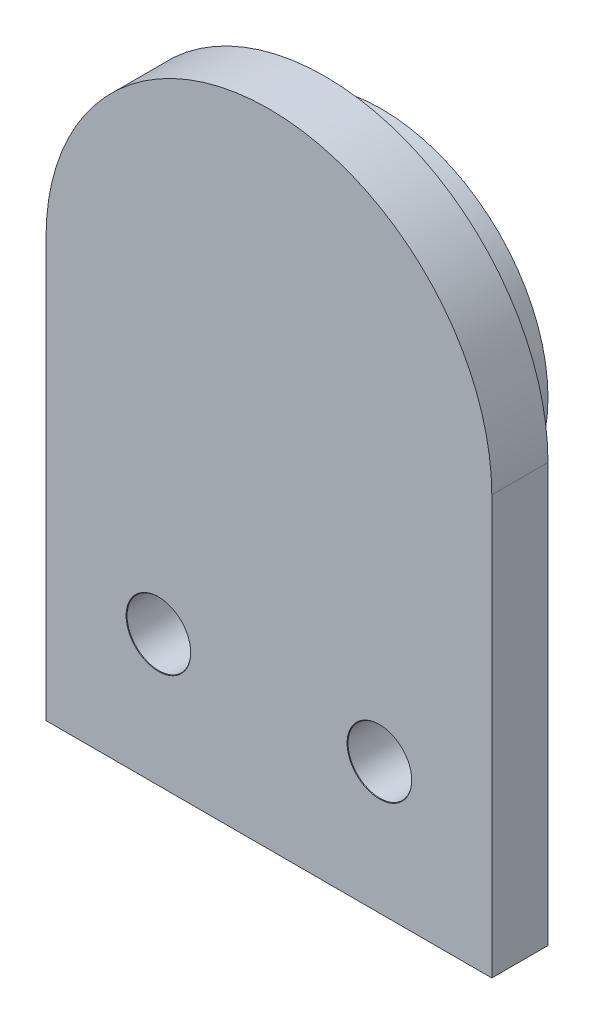
ISO-10303-21;
HEADER;
FILE_DESCRIPTION(('STEP AP214'),'2;1');
FILE_NAME('part.step','',(''),(''),'','','');
FILE_SCHEMA(('AUTOMOTIVE_DESIGN { 1 0 10303 214 1 1 1 1 }'));
ENDSEC;
DATA;
#1=APPLICATION_CONTEXT('core data for automotive mechanical design processes');
#2=APPLICATION_PROTOCOL_DEFINITION('international standard','automotive_design',2000,#1);
#3=PRODUCT_CONTEXT('',#1,'mechanical');
#4=PRODUCT('Part','Part','',(#3));
#5=PRODUCT_RELATED_PRODUCT_CATEGORY('part','',(#4));
#6=PRODUCT_DEFINITION_FORMATION('','',#4);
#7=PRODUCT_DEFINITION_CONTEXT('part definition',#1,'design');
#8=PRODUCT_DEFINITION('design','',#6,#7);
#9=PRODUCT_DEFINITION_SHAPE('','',#8);
#10=(LENGTH_UNIT() NAMED_UNIT(*) SI_UNIT(.MILLI.,.METRE.));
#11=(NAMED_UNIT(*) PLANE_ANGLE_UNIT() SI_UNIT($,.RADIAN.));
#12=(NAMED_UNIT(*) SI_UNIT($,.STERADIAN.) SOLID_ANGLE_UNIT());
#13=UNCERTAINTY_MEASURE_WITH_UNIT(LENGTH_MEASURE(1.E-05),#10,'distance_accuracy_value','');
#14=(GEOMETRIC_REPRESENTATION_CONTEXT(3) GLOBAL_UNCERTAINTY_ASSIGNED_CONTEXT((#13)) GLOBAL_UNIT_ASSIGNED_CONTEXT((#10,
#11,#12)) REPRESENTATION_CONTEXT('',''));
#15=CARTESIAN_POINT('',(0.,0.,0.));
#16=DIRECTION('',(0.,0.,1.));
#17=DIRECTION('',(1.,0.,0.));
#18=AXIS2_PLACEMENT_3D('',#15,#16,#17);
#19=CARTESIAN_POINT('',(0.,0.,3.));
#20=DIRECTION('',(0.,0.,-1.));
#21=DIRECTION('',(-1.,0.,0.));
#22=AXIS2_PLACEMENT_3D('',#19,#20,#21);
#23=CYLINDRICAL_SURFACE('',#22,11.9);
#24=CARTESIAN_POINT('',(0.,0.,0.));
#25=DIRECTION('',(0.,0.,1.));
#26=DIRECTION('',(1.,0.,0.));
#27=AXIS2_PLACEMENT_3D('',#24,#25,#26);
#28=CIRCLE('',#27,11.9);
#29=CARTESIAN_POINT('',(11.9,0.,0.));
#30=VERTEX_POINT('',#29);
#31=CARTESIAN_POINT('',(-11.9,0.,0.));
#32=VERTEX_POINT('',#31);
#33=EDGE_CURVE('E106',#30,#32,#28,.T.);
#34=ORIENTED_EDGE('',*,*,#33,.T.);
#35=DIRECTION('',(0.,0.,-1.));
#36=VECTOR('',#35,1.);
#37=CARTESIAN_POINT('',(-11.9,0.,3.));
#38=LINE('',#37,#36);
#39=CARTESIAN_POINT('',(-11.9,0.,3.));
#40=VERTEX_POINT('',#39);
#41=EDGE_CURVE('E97',#40,#32,#38,.T.);
#42=ORIENTED_EDGE('',*,*,#41,.F.);
#43=CARTESIAN_POINT('',(0.,0.,3.));
#44=DIRECTION('',(0.,0.,1.));
#45=DIRECTION('',(1.,0.,0.));
#46=AXIS2_PLACEMENT_3D('',#43,#44,#45);
#47=CIRCLE('',#46,11.9);
#48=CARTESIAN_POINT('',(11.9,0.,3.));
#49=VERTEX_POINT('',#48);
#50=EDGE_CURVE('E91',#49,#40,#47,.T.);
#51=ORIENTED_EDGE('',*,*,#50,.F.);
#52=DIRECTION('',(0.,0.,-1.));
#53=VECTOR('',#52,1.);
#54=CARTESIAN_POINT('',(11.9,0.,3.));
#55=LINE('',#54,#53);
#56=EDGE_CURVE('E102',#49,#30,#55,.T.);
#57=ORIENTED_EDGE('',*,*,#56,.T.);
#58=EDGE_LOOP('',(#34,#42,#51,#57));
#59=FACE_BOUND('',#58,.T.);
#60=ADVANCED_FACE('F37',(#59),#23,.T.);
#61=CARTESIAN_POINT('',(-11.9,0.,3.));
#62=DIRECTION('',(1.,0.,0.));
#63=DIRECTION('',(0.,0.,-1.));
#64=AXIS2_PLACEMENT_3D('',#61,#62,#63);
#65=PLANE('',#64);
#66=DIRECTION('',(0.,-1.,0.));
#67=VECTOR('',#66,1.);
#68=CARTESIAN_POINT('',(-11.9,0.,0.));
#69=LINE('',#68,#67);
#70=CARTESIAN_POINT('',(-11.9,-22.34,0.));
#71=VERTEX_POINT('',#70);
#72=EDGE_CURVE('E96',#32,#71,#69,.T.);
#73=ORIENTED_EDGE('',*,*,#72,.T.);
#74=DIRECTION('',(0.,0.,-1.));
#75=VECTOR('',#74,1.);
#76=CARTESIAN_POINT('',(-11.9,-22.34,3.));
#77=LINE('',#76,#75);
#78=CARTESIAN_POINT('',(-11.9,-22.34,3.));
#79=VERTEX_POINT('',#78);
#80=EDGE_CURVE('E94',#79,#71,#77,.T.);
#81=ORIENTED_EDGE('',*,*,#80,.F.);
#82=DIRECTION('',(0.,-1.,0.));
#83=VECTOR('',#82,1.);
#84=CARTESIAN_POINT('',(-11.9,0.,3.));
#85=LINE('',#84,#83);
#86=EDGE_CURVE('E86',#40,#79,#85,.T.);
#87=ORIENTED_EDGE('',*,*,#86,.F.);
#88=ORIENTED_EDGE('',*,*,#41,.T.);
#89=EDGE_LOOP('',(#73,#81,#87,#88));
#90=FACE_BOUND('',#89,.T.);
#91=ADVANCED_FACE('F95',(#90),#65,.F.);
#92=CARTESIAN_POINT('',(-11.9,-22.34,3.));
#93=DIRECTION('',(0.,1.,0.));
#94=DIRECTION('',(0.,0.,1.));
#95=AXIS2_PLACEMENT_3D('',#92,#93,#94);
#96=PLANE('',#95);
#97=DIRECTION('',(1.,0.,0.));
#98=VECTOR('',#97,1.);
#99=CARTESIAN_POINT('',(-11.9,-22.34,0.));
#100=LINE('',#99,#98);
#101=CARTESIAN_POINT('',(11.9,-22.34,0.));
#102=VERTEX_POINT('',#101);
#103=EDGE_CURVE('E72',#71,#102,#100,.T.);
#104=ORIENTED_EDGE('',*,*,#103,.T.);
#105=DIRECTION('',(0.,0.,-1.));
#106=VECTOR('',#105,1.);
#107=CARTESIAN_POINT('',(11.9,-22.34,3.));
#108=LINE('',#107,#106);
#109=CARTESIAN_POINT('',(11.9,-22.34,3.));
#110=VERTEX_POINT('',#109);
#111=EDGE_CURVE('E98',#110,#102,#108,.T.);
#112=ORIENTED_EDGE('',*,*,#111,.F.);
#113=DIRECTION('',(1.,0.,0.));
#114=VECTOR('',#113,1.);
#115=CARTESIAN_POINT('',(-11.9,-22.34,3.));
#116=LINE('',#115,#114);
#117=EDGE_CURVE('E89',#79,#110,#116,.T.);
#118=ORIENTED_EDGE('',*,*,#117,.F.);
#119=ORIENTED_EDGE('',*,*,#80,.T.);
#120=EDGE_LOOP('',(#104,#112,#118,#119));
#121=FACE_BOUND('',#120,.T.);
#122=ADVANCED_FACE('F100',(#121),#96,.F.);
#123=CARTESIAN_POINT('',(11.9,-22.34,3.));
#124=DIRECTION('',(-1.,0.,0.));
#125=DIRECTION('',(0.,0.,1.));
#126=AXIS2_PLACEMENT_3D('',#123,#124,#125);
#127=PLANE('',#126);
#128=DIRECTION('',(0.,1.,0.));
#129=VECTOR('',#128,1.);
#130=CARTESIAN_POINT('',(11.9,-22.34,0.));
#131=LINE('',#130,#129);
#132=EDGE_CURVE('E78',#102,#30,#131,.T.);
#133=ORIENTED_EDGE('',*,*,#132,.T.);
#134=ORIENTED_EDGE('',*,*,#56,.F.);
#135=DIRECTION('',(0.,1.,0.));
#136=VECTOR('',#135,1.);
#137=CARTESIAN_POINT('',(11.9,-22.34,3.));
#138=LINE('',#137,#136);
#139=EDGE_CURVE('E55',#110,#49,#138,.T.);
#140=ORIENTED_EDGE('',*,*,#139,.F.);
#141=ORIENTED_EDGE('',*,*,#111,.T.);
#142=EDGE_LOOP('',(#133,#134,#140,#141));
#143=FACE_BOUND('',#142,.T.);
#144=ADVANCED_FACE('F146',(#143),#127,.F.);
#145=CARTESIAN_POINT('',(0.,0.,3.));
#146=DIRECTION('',(0.,0.,1.));
#147=DIRECTION('',(1.,0.,0.));
#148=AXIS2_PLACEMENT_3D('',#145,#146,#147);
#149=PLANE('',#148);
#150=CARTESIAN_POINT('',(-5.9,-15.34,3.));
#151=DIRECTION('',(0.,0.,1.));
#152=DIRECTION('',(1.,0.,0.));
#153=AXIS2_PLACEMENT_3D('',#150,#151,#152);
#154=CIRCLE('',#153,1.725);
#155=CARTESIAN_POINT('',(-4.175,-15.34,3.));
#156=VERTEX_POINT('',#155);
#157=EDGE_CURVE('E304',#156,#156,#154,.T.);
#158=ORIENTED_EDGE('',*,*,#157,.F.);
#159=EDGE_LOOP('',(#158));
#160=FACE_BOUND('',#159,.T.);
#161=CARTESIAN_POINT('',(5.9,-15.34,3.));
#162=DIRECTION('',(0.,0.,1.));
#163=DIRECTION('',(1.,0.,0.));
#164=AXIS2_PLACEMENT_3D('',#161,#162,#163);
#165=CIRCLE('',#164,1.725);
#166=CARTESIAN_POINT('',(7.625,-15.34,3.));
#167=VERTEX_POINT('',#166);
#168=EDGE_CURVE('E124',#167,#167,#165,.T.);
#169=ORIENTED_EDGE('',*,*,#168,.F.);
#170=EDGE_LOOP('',(#169));
#171=FACE_BOUND('',#170,.T.);
#172=ORIENTED_EDGE('',*,*,#50,.T.);
#173=ORIENTED_EDGE('',*,*,#86,.T.);
#174=ORIENTED_EDGE('',*,*,#117,.T.);
#175=ORIENTED_EDGE('',*,*,#139,.T.);
#176=EDGE_LOOP('',(#172,#173,#174,#175));
#177=FACE_BOUND('',#176,.T.);
#178=ADVANCED_FACE('F87',(#160,#171,#177),#149,.T.);
#179=CARTESIAN_POINT('',(0.,0.,0.));
#180=DIRECTION('',(0.,0.,1.));
#181=DIRECTION('',(1.,0.,0.));
#182=AXIS2_PLACEMENT_3D('',#179,#180,#181);
#183=PLANE('',#182);
#184=CARTESIAN_POINT('',(-5.9,-15.34,0.));
#185=DIRECTION('',(0.,0.,1.));
#186=DIRECTION('',(1.,0.,0.));
#187=AXIS2_PLACEMENT_3D('',#184,#185,#186);
#188=CIRCLE('',#187,1.7);
#189=CARTESIAN_POINT('',(-4.2,-15.34,0.));
#190=VERTEX_POINT('',#189);
#191=EDGE_CURVE('E40',#190,#190,#188,.T.);
#192=ORIENTED_EDGE('',*,*,#191,.T.);
#193=EDGE_LOOP('',(#192));
#194=FACE_BOUND('',#193,.T.);
#195=CARTESIAN_POINT('',(5.9,-15.34,0.));
#196=DIRECTION('',(0.,0.,1.));
#197=DIRECTION('',(1.,0.,0.));
#198=AXIS2_PLACEMENT_3D('',#195,#196,#197);
#199=CIRCLE('',#198,1.7);
#200=CARTESIAN_POINT('',(7.6,-15.34,0.));
#201=VERTEX_POINT('',#200);
#202=EDGE_CURVE('E115',#201,#201,#199,.T.);
#203=ORIENTED_EDGE('',*,*,#202,.T.);
#204=EDGE_LOOP('',(#203));
#205=FACE_BOUND('',#204,.T.);
#206=CARTESIAN_POINT('',(0.,0.,0.));
#207=DIRECTION('',(0.,0.,-1.));
#208=DIRECTION('',(-1.,0.,0.));
#209=AXIS2_PLACEMENT_3D('',#206,#207,#208);
#210=CIRCLE('',#209,8.9);
#211=CARTESIAN_POINT('',(-8.9,0.,0.));
#212=VERTEX_POINT('',#211);
#213=EDGE_CURVE('E46',#212,#212,#210,.T.);
#214=ORIENTED_EDGE('',*,*,#213,.F.);
#215=EDGE_LOOP('',(#214));
#216=FACE_BOUND('',#215,.T.);
#217=ORIENTED_EDGE('',*,*,#33,.F.);
#218=ORIENTED_EDGE('',*,*,#132,.F.);
#219=ORIENTED_EDGE('',*,*,#103,.F.);
#220=ORIENTED_EDGE('',*,*,#72,.F.);
#221=EDGE_LOOP('',(#217,#218,#219,#220));
#222=FACE_BOUND('',#221,.T.);
#223=ADVANCED_FACE('F139',(#194,#205,#216,#222),#183,.F.);
#224=CARTESIAN_POINT('',(0.,0.,-3.));
#225=DIRECTION('',(0.,0.,1.));
#226=DIRECTION('',(1.,0.,0.));
#227=AXIS2_PLACEMENT_3D('',#224,#225,#226);
#228=CYLINDRICAL_SURFACE('',#227,8.9);
#229=CARTESIAN_POINT('',(0.,0.,-3.));
#230=DIRECTION('',(0.,0.,-1.));
#231=DIRECTION('',(-1.,0.,0.));
#232=AXIS2_PLACEMENT_3D('',#229,#230,#231);
#233=CIRCLE('',#232,8.9);
#234=CARTESIAN_POINT('',(-8.9,0.,-3.));
#235=VERTEX_POINT('',#234);
#236=EDGE_CURVE('E109',#235,#235,#233,.T.);
#237=ORIENTED_EDGE('',*,*,#236,.F.);
#238=EDGE_LOOP('',(#237));
#239=FACE_BOUND('',#238,.T.);
#240=ORIENTED_EDGE('',*,*,#213,.T.);
#241=EDGE_LOOP('',(#240));
#242=FACE_BOUND('',#241,.T.);
#243=ADVANCED_FACE('F137',(#239,#242),#228,.T.);
#244=CARTESIAN_POINT('',(0.,0.,-3.));
#245=DIRECTION('',(0.,0.,-1.));
#246=DIRECTION('',(-1.,0.,0.));
#247=AXIS2_PLACEMENT_3D('',#244,#245,#246);
#248=PLANE('',#247);
#249=CARTESIAN_POINT('',(0.,0.,-3.));
#250=DIRECTION('',(0.,0.,-1.));
#251=DIRECTION('',(-1.,0.,0.));
#252=AXIS2_PLACEMENT_3D('',#249,#250,#251);
#253=CIRCLE('',#252,2.);
#254=CARTESIAN_POINT('',(-2.,0.,-3.));
#255=VERTEX_POINT('',#254);
#256=EDGE_CURVE('E11',#255,#255,#253,.T.);
#257=ORIENTED_EDGE('',*,*,#256,.F.);
#258=EDGE_LOOP('',(#257));
#259=FACE_BOUND('',#258,.T.);
#260=ORIENTED_EDGE('',*,*,#236,.T.);
#261=EDGE_LOOP('',(#260));
#262=FACE_BOUND('',#261,.T.);
#263=ADVANCED_FACE('F182',(#259,#262),#248,.T.);
#264=CARTESIAN_POINT('',(0.,0.,-6.));
#265=DIRECTION('',(0.,0.,1.));
#266=DIRECTION('',(1.,0.,0.));
#267=AXIS2_PLACEMENT_3D('',#264,#265,#266);
#268=CYLINDRICAL_SURFACE('',#267,2.);
#269=CARTESIAN_POINT('',(0.,0.,-6.));
#270=DIRECTION('',(0.,0.,-1.));
#271=DIRECTION('',(-1.,0.,0.));
#272=AXIS2_PLACEMENT_3D('',#269,#270,#271);
#273=CIRCLE('',#272,2.);
#274=CARTESIAN_POINT('',(-2.,0.,-6.));
#275=VERTEX_POINT('',#274);
#276=EDGE_CURVE('E117',#275,#275,#273,.T.);
#277=ORIENTED_EDGE('',*,*,#276,.F.);
#278=EDGE_LOOP('',(#277));
#279=FACE_BOUND('',#278,.T.);
#280=ORIENTED_EDGE('',*,*,#256,.T.);
#281=EDGE_LOOP('',(#280));
#282=FACE_BOUND('',#281,.T.);
#283=ADVANCED_FACE('F194',(#279,#282),#268,.T.);
#284=CARTESIAN_POINT('',(0.,0.,-6.));
#285=DIRECTION('',(0.,0.,-1.));
#286=DIRECTION('',(-1.,0.,0.));
#287=AXIS2_PLACEMENT_3D('',#284,#285,#286);
#288=PLANE('',#287);
#289=ORIENTED_EDGE('',*,*,#276,.T.);
#290=EDGE_LOOP('',(#289));
#291=FACE_BOUND('',#290,.T.);
#292=ADVANCED_FACE('F205',(#291),#288,.T.);
#293=CARTESIAN_POINT('',(5.9,-15.34,3.));
#294=DIRECTION('',(0.,0.,1.));
#295=DIRECTION('',(1.,0.,0.));
#296=AXIS2_PLACEMENT_3D('',#293,#294,#295);
#297=CYLINDRICAL_SURFACE('',#296,1.7);
#298=CARTESIAN_POINT('',(5.9,-15.34,2.975));
#299=DIRECTION('',(0.,0.,1.));
#300=DIRECTION('',(1.,0.,0.));
#301=AXIS2_PLACEMENT_3D('',#298,#299,#300);
#302=CIRCLE('',#301,1.7);
#303=CARTESIAN_POINT('',(7.6,-15.34,2.975));
#304=VERTEX_POINT('',#303);
#305=EDGE_CURVE('E118',#304,#304,#302,.T.);
#306=ORIENTED_EDGE('',*,*,#305,.T.);
#307=EDGE_LOOP('',(#306));
#308=FACE_BOUND('',#307,.T.);
#309=ORIENTED_EDGE('',*,*,#202,.F.);
#310=EDGE_LOOP('',(#309));
#311=FACE_BOUND('',#310,.T.);
#312=ADVANCED_FACE('F216',(#308,#311),#297,.F.);
#313=CARTESIAN_POINT('',(5.9,-15.34,3.));
#314=DIRECTION('',(0.,0.,1.));
#315=DIRECTION('',(1.,0.,0.));
#316=AXIS2_PLACEMENT_3D('',#313,#314,#315);
#317=CONICAL_SURFACE('',#316,1.725,0.785398163397431);
#318=ORIENTED_EDGE('',*,*,#305,.F.);
#319=EDGE_LOOP('',(#318));
#320=FACE_BOUND('',#319,.T.);
#321=ORIENTED_EDGE('',*,*,#168,.T.);
#322=EDGE_LOOP('',(#321));
#323=FACE_BOUND('',#322,.T.);
#324=ADVANCED_FACE('F239',(#320,#323),#317,.F.);
#325=CARTESIAN_POINT('',(-5.9,-15.34,3.));
#326=DIRECTION('',(0.,0.,1.));
#327=DIRECTION('',(1.,0.,0.));
#328=AXIS2_PLACEMENT_3D('',#325,#326,#327);
#329=CYLINDRICAL_SURFACE('',#328,1.7);
#330=CARTESIAN_POINT('',(-5.9,-15.34,2.975));
#331=DIRECTION('',(0.,0.,1.));
#332=DIRECTION('',(1.,0.,0.));
#333=AXIS2_PLACEMENT_3D('',#330,#331,#332);
#334=CIRCLE('',#333,1.7);
#335=CARTESIAN_POINT('',(-4.2,-15.34,2.975));
#336=VERTEX_POINT('',#335);
#337=EDGE_CURVE('E301',#336,#336,#334,.T.);
#338=ORIENTED_EDGE('',*,*,#337,.T.);
#339=EDGE_LOOP('',(#338));
#340=FACE_BOUND('',#339,.T.);
#341=ORIENTED_EDGE('',*,*,#191,.F.);
#342=EDGE_LOOP('',(#341));
#343=FACE_BOUND('',#342,.T.);
#344=ADVANCED_FACE('F249',(#340,#343),#329,.F.);
#345=CARTESIAN_POINT('',(-5.9,-15.34,3.));
#346=DIRECTION('',(0.,0.,1.));
#347=DIRECTION('',(1.,0.,0.));
#348=AXIS2_PLACEMENT_3D('',#345,#346,#347);
#349=CONICAL_SURFACE('',#348,1.725,0.785398163397431);
#350=ORIENTED_EDGE('',*,*,#337,.F.);
#351=EDGE_LOOP('',(#350));
#352=FACE_BOUND('',#351,.T.);
#353=ORIENTED_EDGE('',*,*,#157,.T.);
#354=EDGE_LOOP('',(#353));
#355=FACE_BOUND('',#354,.T.);
#356=ADVANCED_FACE('F260',(#352,#355),#349,.F.);
#357=CLOSED_SHELL('',(#60,#91,#122,#144,#178,#223,#243,#263,#283,#292,#312,#324,#344,#356));
#358=MANIFOLD_SOLID_BREP('B2',#357);
#359=ADVANCED_BREP_SHAPE_REPRESENTATION('',(#18,#358),#14);
#360=SHAPE_DEFINITION_REPRESENTATION(#9,#359);
ENDSEC;
END-ISO-10303-21;
